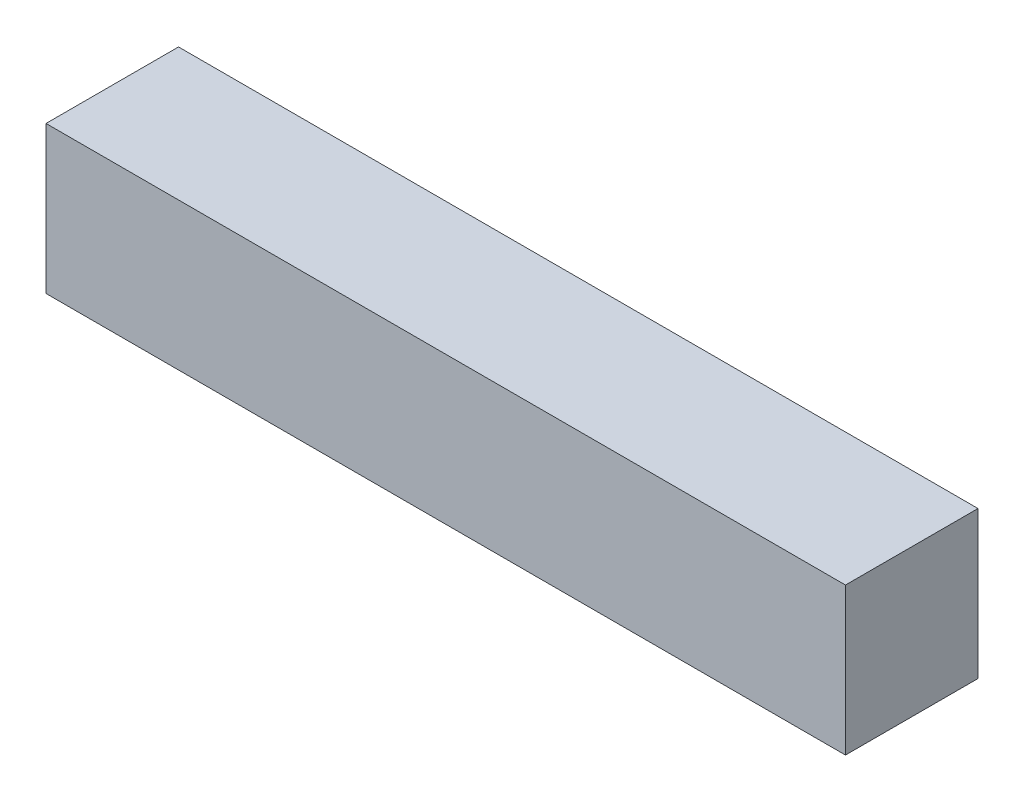
ISO-10303-21;
HEADER;
FILE_DESCRIPTION(('STEP AP214'),'2;1');
FILE_NAME('part.step','',(''),(''),'','','');
FILE_SCHEMA(('AUTOMOTIVE_DESIGN { 1 0 10303 214 1 1 1 1 }'));
ENDSEC;
DATA;
#1=APPLICATION_CONTEXT('core data for automotive mechanical design processes');
#2=APPLICATION_PROTOCOL_DEFINITION('international standard','automotive_design',2000,#1);
#3=PRODUCT_CONTEXT('',#1,'mechanical');
#4=PRODUCT('Part','Part','',(#3));
#5=PRODUCT_RELATED_PRODUCT_CATEGORY('part','',(#4));
#6=PRODUCT_DEFINITION_FORMATION('','',#4);
#7=PRODUCT_DEFINITION_CONTEXT('part definition',#1,'design');
#8=PRODUCT_DEFINITION('design','',#6,#7);
#9=PRODUCT_DEFINITION_SHAPE('','',#8);
#10=(LENGTH_UNIT() NAMED_UNIT(*) SI_UNIT(.MILLI.,.METRE.));
#11=(NAMED_UNIT(*) PLANE_ANGLE_UNIT() SI_UNIT($,.RADIAN.));
#12=(NAMED_UNIT(*) SI_UNIT($,.STERADIAN.) SOLID_ANGLE_UNIT());
#13=UNCERTAINTY_MEASURE_WITH_UNIT(LENGTH_MEASURE(1.E-05),#10,'distance_accuracy_value','');
#14=(GEOMETRIC_REPRESENTATION_CONTEXT(3) GLOBAL_UNCERTAINTY_ASSIGNED_CONTEXT((#13)) GLOBAL_UNIT_ASSIGNED_CONTEXT((#10,
#11,#12)) REPRESENTATION_CONTEXT('',''));
#15=CARTESIAN_POINT('',(0.,0.,0.));
#16=DIRECTION('',(0.,0.,1.));
#17=DIRECTION('',(1.,0.,0.));
#18=AXIS2_PLACEMENT_3D('',#15,#16,#17);
#19=CARTESIAN_POINT('',(241.3,-44.45,-80.));
#20=DIRECTION('',(1.,0.,0.));
#21=DIRECTION('',(0.,0.,-1.));
#22=AXIS2_PLACEMENT_3D('',#19,#20,#21);
#23=PLANE('',#22);
#24=DIRECTION('',(0.,1.,0.));
#25=VECTOR('',#24,1.);
#26=CARTESIAN_POINT('',(241.3,-44.45,0.));
#27=LINE('',#26,#25);
#28=CARTESIAN_POINT('',(241.3,-44.45,0.));
#29=VERTEX_POINT('',#28);
#30=CARTESIAN_POINT('',(241.3,44.45,0.));
#31=VERTEX_POINT('',#30);
#32=EDGE_CURVE('E97',#29,#31,#27,.T.);
#33=ORIENTED_EDGE('',*,*,#32,.F.);
#34=DIRECTION('',(0.,0.,1.));
#35=VECTOR('',#34,1.);
#36=CARTESIAN_POINT('',(241.3,-44.45,-80.));
#37=LINE('',#36,#35);
#38=CARTESIAN_POINT('',(241.3,-44.45,-80.));
#39=VERTEX_POINT('',#38);
#40=EDGE_CURVE('E11',#39,#29,#37,.T.);
#41=ORIENTED_EDGE('',*,*,#40,.F.);
#42=DIRECTION('',(0.,1.,0.));
#43=VECTOR('',#42,1.);
#44=CARTESIAN_POINT('',(241.3,-44.45,-80.));
#45=LINE('',#44,#43);
#46=CARTESIAN_POINT('',(241.3,44.45,-80.));
#47=VERTEX_POINT('',#46);
#48=EDGE_CURVE('E91',#39,#47,#45,.T.);
#49=ORIENTED_EDGE('',*,*,#48,.T.);
#50=DIRECTION('',(0.,0.,1.));
#51=VECTOR('',#50,1.);
#52=CARTESIAN_POINT('',(241.3,44.45,-80.));
#53=LINE('',#52,#51);
#54=EDGE_CURVE('E36',#47,#31,#53,.T.);
#55=ORIENTED_EDGE('',*,*,#54,.T.);
#56=EDGE_LOOP('',(#33,#41,#49,#55));
#57=FACE_BOUND('',#56,.T.);
#58=ADVANCED_FACE('F33',(#57),#23,.T.);
#59=CARTESIAN_POINT('',(-241.3,-44.45,-80.));
#60=DIRECTION('',(0.,-1.,0.));
#61=DIRECTION('',(0.,0.,-1.));
#62=AXIS2_PLACEMENT_3D('',#59,#60,#61);
#63=PLANE('',#62);
#64=DIRECTION('',(1.,0.,0.));
#65=VECTOR('',#64,1.);
#66=CARTESIAN_POINT('',(-241.3,-44.45,0.));
#67=LINE('',#66,#65);
#68=CARTESIAN_POINT('',(-241.3,-44.45,0.));
#69=VERTEX_POINT('',#68);
#70=EDGE_CURVE('E93',#69,#29,#67,.T.);
#71=ORIENTED_EDGE('',*,*,#70,.F.);
#72=DIRECTION('',(0.,0.,1.));
#73=VECTOR('',#72,1.);
#74=CARTESIAN_POINT('',(-241.3,-44.45,-80.));
#75=LINE('',#74,#73);
#76=CARTESIAN_POINT('',(-241.3,-44.45,-80.));
#77=VERTEX_POINT('',#76);
#78=EDGE_CURVE('E42',#77,#69,#75,.T.);
#79=ORIENTED_EDGE('',*,*,#78,.F.);
#80=DIRECTION('',(1.,0.,0.));
#81=VECTOR('',#80,1.);
#82=CARTESIAN_POINT('',(-241.3,-44.45,-80.));
#83=LINE('',#82,#81);
#84=EDGE_CURVE('E88',#77,#39,#83,.T.);
#85=ORIENTED_EDGE('',*,*,#84,.T.);
#86=ORIENTED_EDGE('',*,*,#40,.T.);
#87=EDGE_LOOP('',(#71,#79,#85,#86));
#88=FACE_BOUND('',#87,.T.);
#89=ADVANCED_FACE('F107',(#88),#63,.T.);
#90=CARTESIAN_POINT('',(-241.3,-44.45,-80.));
#91=DIRECTION('',(-1.,0.,0.));
#92=DIRECTION('',(0.,0.,1.));
#93=AXIS2_PLACEMENT_3D('',#90,#91,#92);
#94=PLANE('',#93);
#95=DIRECTION('',(0.,-1.,0.));
#96=VECTOR('',#95,1.);
#97=CARTESIAN_POINT('',(-241.3,-44.45,0.));
#98=LINE('',#97,#96);
#99=CARTESIAN_POINT('',(-241.3,44.45,0.));
#100=VERTEX_POINT('',#99);
#101=EDGE_CURVE('E83',#100,#69,#98,.T.);
#102=ORIENTED_EDGE('',*,*,#101,.F.);
#103=DIRECTION('',(0.,0.,1.));
#104=VECTOR('',#103,1.);
#105=CARTESIAN_POINT('',(-241.3,44.45,-80.));
#106=LINE('',#105,#104);
#107=CARTESIAN_POINT('',(-241.3,44.45,-80.));
#108=VERTEX_POINT('',#107);
#109=EDGE_CURVE('E78',#108,#100,#106,.T.);
#110=ORIENTED_EDGE('',*,*,#109,.F.);
#111=DIRECTION('',(0.,-1.,0.));
#112=VECTOR('',#111,1.);
#113=CARTESIAN_POINT('',(-241.3,-44.45,-80.));
#114=LINE('',#113,#112);
#115=EDGE_CURVE('E81',#108,#77,#114,.T.);
#116=ORIENTED_EDGE('',*,*,#115,.T.);
#117=ORIENTED_EDGE('',*,*,#78,.T.);
#118=EDGE_LOOP('',(#102,#110,#116,#117));
#119=FACE_BOUND('',#118,.T.);
#120=ADVANCED_FACE('F80',(#119),#94,.T.);
#121=CARTESIAN_POINT('',(-241.3,44.45,-80.));
#122=DIRECTION('',(0.,1.,0.));
#123=DIRECTION('',(0.,0.,1.));
#124=AXIS2_PLACEMENT_3D('',#121,#122,#123);
#125=PLANE('',#124);
#126=DIRECTION('',(-1.,0.,0.));
#127=VECTOR('',#126,1.);
#128=CARTESIAN_POINT('',(-241.3,44.45,0.));
#129=LINE('',#128,#127);
#130=EDGE_CURVE('E100',#31,#100,#129,.T.);
#131=ORIENTED_EDGE('',*,*,#130,.F.);
#132=ORIENTED_EDGE('',*,*,#54,.F.);
#133=DIRECTION('',(-1.,0.,0.));
#134=VECTOR('',#133,1.);
#135=CARTESIAN_POINT('',(-241.3,44.45,-80.));
#136=LINE('',#135,#134);
#137=EDGE_CURVE('E87',#47,#108,#136,.T.);
#138=ORIENTED_EDGE('',*,*,#137,.T.);
#139=ORIENTED_EDGE('',*,*,#109,.T.);
#140=EDGE_LOOP('',(#131,#132,#138,#139));
#141=FACE_BOUND('',#140,.T.);
#142=ADVANCED_FACE('F90',(#141),#125,.T.);
#143=CARTESIAN_POINT('',(0.,0.,-80.));
#144=DIRECTION('',(0.,0.,-1.));
#145=DIRECTION('',(-1.,0.,0.));
#146=AXIS2_PLACEMENT_3D('',#143,#144,#145);
#147=PLANE('',#146);
#148=ORIENTED_EDGE('',*,*,#48,.F.);
#149=ORIENTED_EDGE('',*,*,#84,.F.);
#150=ORIENTED_EDGE('',*,*,#115,.F.);
#151=ORIENTED_EDGE('',*,*,#137,.F.);
#152=EDGE_LOOP('',(#148,#149,#150,#151));
#153=FACE_BOUND('',#152,.T.);
#154=ADVANCED_FACE('F86',(#153),#147,.T.);
#155=CARTESIAN_POINT('',(0.,0.,0.));
#156=DIRECTION('',(0.,0.,-1.));
#157=DIRECTION('',(-1.,0.,0.));
#158=AXIS2_PLACEMENT_3D('',#155,#156,#157);
#159=PLANE('',#158);
#160=ORIENTED_EDGE('',*,*,#32,.T.);
#161=ORIENTED_EDGE('',*,*,#130,.T.);
#162=ORIENTED_EDGE('',*,*,#101,.T.);
#163=ORIENTED_EDGE('',*,*,#70,.T.);
#164=EDGE_LOOP('',(#160,#161,#162,#163));
#165=FACE_BOUND('',#164,.T.);
#166=ADVANCED_FACE('F106',(#165),#159,.F.);
#167=CLOSED_SHELL('',(#58,#89,#120,#142,#154,#166));
#168=MANIFOLD_SOLID_BREP('B2',#167);
#169=ADVANCED_BREP_SHAPE_REPRESENTATION('',(#18,#168),#14);
#170=SHAPE_DEFINITION_REPRESENTATION(#9,#169);
ENDSEC;
END-ISO-10303-21;
